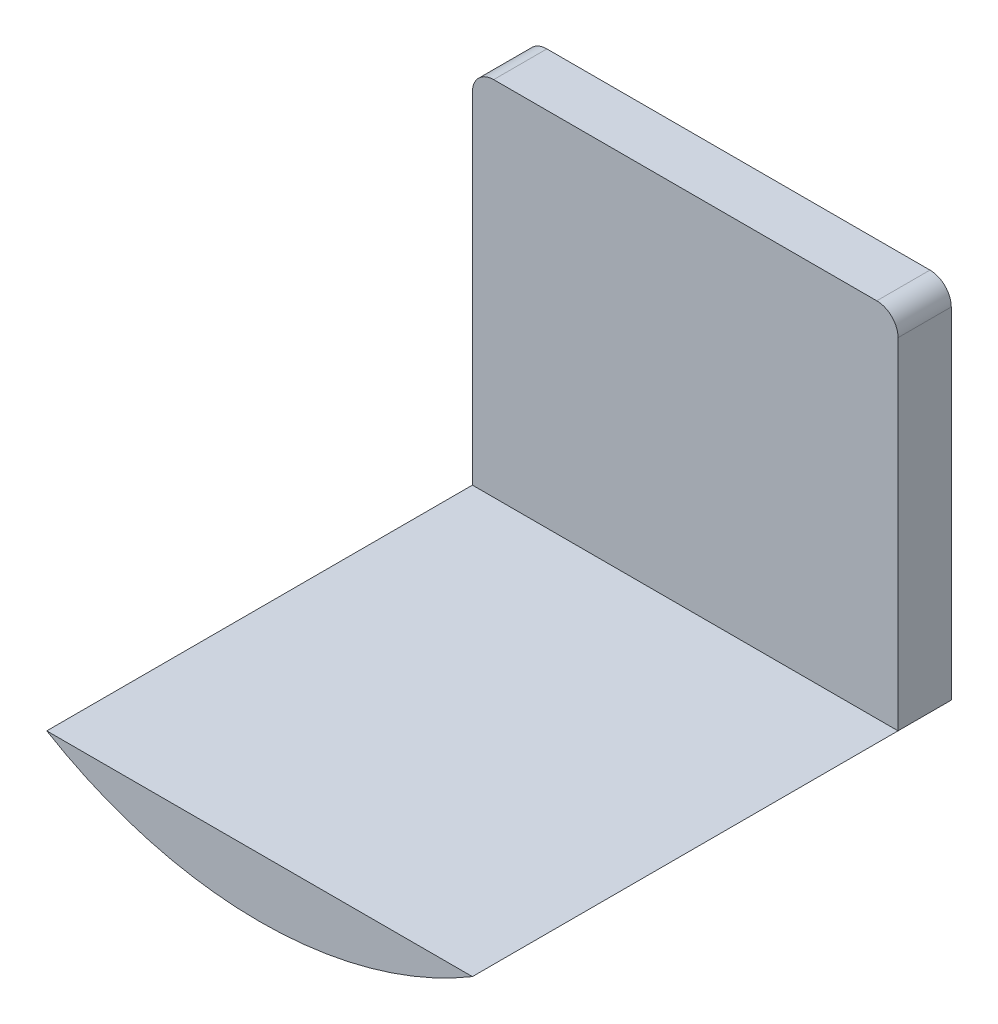
ISO-10303-21;
HEADER;
FILE_DESCRIPTION(('STEP AP214'),'2;1');
FILE_NAME('part.step','',(''),(''),'','','');
FILE_SCHEMA(('AUTOMOTIVE_DESIGN { 1 0 10303 214 1 1 1 1 }'));
ENDSEC;
DATA;
#1=APPLICATION_CONTEXT('core data for automotive mechanical design processes');
#2=APPLICATION_PROTOCOL_DEFINITION('international standard','automotive_design',2000,#1);
#3=PRODUCT_CONTEXT('',#1,'mechanical');
#4=PRODUCT('Part','Part','',(#3));
#5=PRODUCT_RELATED_PRODUCT_CATEGORY('part','',(#4));
#6=PRODUCT_DEFINITION_FORMATION('','',#4);
#7=PRODUCT_DEFINITION_CONTEXT('part definition',#1,'design');
#8=PRODUCT_DEFINITION('design','',#6,#7);
#9=PRODUCT_DEFINITION_SHAPE('','',#8);
#10=(LENGTH_UNIT() NAMED_UNIT(*) SI_UNIT(.MILLI.,.METRE.));
#11=(NAMED_UNIT(*) PLANE_ANGLE_UNIT() SI_UNIT($,.RADIAN.));
#12=(NAMED_UNIT(*) SI_UNIT($,.STERADIAN.) SOLID_ANGLE_UNIT());
#13=UNCERTAINTY_MEASURE_WITH_UNIT(LENGTH_MEASURE(1.E-05),#10,'distance_accuracy_value','');
#14=(GEOMETRIC_REPRESENTATION_CONTEXT(3) GLOBAL_UNCERTAINTY_ASSIGNED_CONTEXT((#13)) GLOBAL_UNIT_ASSIGNED_CONTEXT((#10,
#11,#12)) REPRESENTATION_CONTEXT('',''));
#15=CARTESIAN_POINT('',(0.,0.,0.));
#16=DIRECTION('',(0.,0.,1.));
#17=DIRECTION('',(1.,0.,0.));
#18=AXIS2_PLACEMENT_3D('',#15,#16,#17);
#19=CARTESIAN_POINT('',(-25.4,-42.5212993686693,57.15));
#20=DIRECTION('',(0.,-1.,0.));
#21=DIRECTION('',(0.,0.,-1.));
#22=AXIS2_PLACEMENT_3D('',#19,#20,#21);
#23=PLANE('',#22);
#24=DIRECTION('',(1.,0.,0.));
#25=VECTOR('',#24,1.);
#26=CARTESIAN_POINT('',(-25.4,-42.5212993686693,6.35));
#27=LINE('',#26,#25);
#28=CARTESIAN_POINT('',(-25.4,-42.5212993686693,6.35));
#29=VERTEX_POINT('',#28);
#30=CARTESIAN_POINT('',(25.4,-42.5212993686693,6.35));
#31=VERTEX_POINT('',#30);
#32=EDGE_CURVE('E120',#29,#31,#27,.T.);
#33=ORIENTED_EDGE('',*,*,#32,.F.);
#34=DIRECTION('',(0.,0.,-1.));
#35=VECTOR('',#34,1.);
#36=CARTESIAN_POINT('',(-25.4,-42.5212993686693,57.15));
#37=LINE('',#36,#35);
#38=CARTESIAN_POINT('',(-25.4,-42.5212993686693,57.15));
#39=VERTEX_POINT('',#38);
#40=EDGE_CURVE('E119',#39,#29,#37,.T.);
#41=ORIENTED_EDGE('',*,*,#40,.F.);
#42=DIRECTION('',(-1.,0.,0.));
#43=VECTOR('',#42,1.);
#44=CARTESIAN_POINT('',(-25.4,-42.5212993686693,57.15));
#45=LINE('',#44,#43);
#46=CARTESIAN_POINT('',(25.4,-42.5212993686693,57.15));
#47=VERTEX_POINT('',#46);
#48=EDGE_CURVE('E136',#47,#39,#45,.T.);
#49=ORIENTED_EDGE('',*,*,#48,.F.);
#50=DIRECTION('',(0.,0.,-1.));
#51=VECTOR('',#50,1.);
#52=CARTESIAN_POINT('',(25.4,-42.5212993686693,57.15));
#53=LINE('',#52,#51);
#54=EDGE_CURVE('E139',#47,#31,#53,.T.);
#55=ORIENTED_EDGE('',*,*,#54,.T.);
#56=EDGE_LOOP('',(#33,#41,#49,#55));
#57=FACE_BOUND('',#56,.T.);
#58=ADVANCED_FACE('F35',(#57),#23,.F.);
#59=CARTESIAN_POINT('',(0.,0.,57.15));
#60=DIRECTION('',(0.,0.,-1.));
#61=DIRECTION('',(-1.,0.,0.));
#62=AXIS2_PLACEMENT_3D('',#59,#60,#61);
#63=CYLINDRICAL_SURFACE('',#62,49.53);
#64=CARTESIAN_POINT('',(0.,0.,0.));
#65=DIRECTION('',(0.,0.,1.));
#66=DIRECTION('',(1.,0.,0.));
#67=AXIS2_PLACEMENT_3D('',#64,#65,#66);
#68=CIRCLE('',#67,49.53);
#69=CARTESIAN_POINT('',(-25.4,-42.5212993686693,0.));
#70=VERTEX_POINT('',#69);
#71=CARTESIAN_POINT('',(25.4,-42.5212993686693,0.));
#72=VERTEX_POINT('',#71);
#73=EDGE_CURVE('E106',#70,#72,#68,.T.);
#74=ORIENTED_EDGE('',*,*,#73,.T.);
#75=DIRECTION('',(0.,0.,-1.));
#76=VECTOR('',#75,1.);
#77=CARTESIAN_POINT('',(25.4,-42.5212993686693,0.));
#78=LINE('',#77,#76);
#79=EDGE_CURVE('E123',#31,#72,#78,.T.);
#80=ORIENTED_EDGE('',*,*,#79,.F.);
#81=ORIENTED_EDGE('',*,*,#54,.F.);
#82=CARTESIAN_POINT('',(0.,0.,57.15));
#83=DIRECTION('',(0.,0.,1.));
#84=DIRECTION('',(1.,0.,0.));
#85=AXIS2_PLACEMENT_3D('',#82,#83,#84);
#86=CIRCLE('',#85,49.53);
#87=EDGE_CURVE('E112',#39,#47,#86,.T.);
#88=ORIENTED_EDGE('',*,*,#87,.F.);
#89=ORIENTED_EDGE('',*,*,#40,.T.);
#90=DIRECTION('',(0.,0.,1.));
#91=VECTOR('',#90,1.);
#92=CARTESIAN_POINT('',(-25.4,-42.5212993686693,0.));
#93=LINE('',#92,#91);
#94=EDGE_CURVE('E98',#70,#29,#93,.T.);
#95=ORIENTED_EDGE('',*,*,#94,.F.);
#96=EDGE_LOOP('',(#74,#80,#81,#88,#89,#95));
#97=FACE_BOUND('',#96,.T.);
#98=ADVANCED_FACE('F116',(#97),#63,.T.);
#99=CARTESIAN_POINT('',(0.,0.,57.15));
#100=DIRECTION('',(0.,0.,1.));
#101=DIRECTION('',(1.,0.,0.));
#102=AXIS2_PLACEMENT_3D('',#99,#100,#101);
#103=PLANE('',#102);
#104=ORIENTED_EDGE('',*,*,#87,.T.);
#105=ORIENTED_EDGE('',*,*,#48,.T.);
#106=EDGE_LOOP('',(#104,#105));
#107=FACE_BOUND('',#106,.T.);
#108=ADVANCED_FACE('F177',(#107),#103,.T.);
#109=CARTESIAN_POINT('',(0.,0.,0.));
#110=DIRECTION('',(0.,0.,1.));
#111=DIRECTION('',(1.,0.,0.));
#112=AXIS2_PLACEMENT_3D('',#109,#110,#111);
#113=PLANE('',#112);
#114=DIRECTION('',(-1.,0.,0.));
#115=VECTOR('',#114,1.);
#116=CARTESIAN_POINT('',(-25.4,0.658700631330653,0.));
#117=LINE('',#116,#115);
#118=CARTESIAN_POINT('',(22.86,0.658700631330653,0.));
#119=VERTEX_POINT('',#118);
#120=CARTESIAN_POINT('',(-22.86,0.658700631330653,0.));
#121=VERTEX_POINT('',#120);
#122=EDGE_CURVE('E103',#119,#121,#117,.T.);
#123=ORIENTED_EDGE('',*,*,#122,.F.);
#124=CARTESIAN_POINT('',(22.86,-1.88129936866935,0.));
#125=DIRECTION('',(0.,0.,1.));
#126=DIRECTION('',(1.,0.,0.));
#127=AXIS2_PLACEMENT_3D('',#124,#125,#126);
#128=CIRCLE('',#127,2.54);
#129=CARTESIAN_POINT('',(25.4,-1.88129936866935,0.));
#130=VERTEX_POINT('',#129);
#131=EDGE_CURVE('E150',#119,#130,#128,.F.);
#132=ORIENTED_EDGE('',*,*,#131,.T.);
#133=DIRECTION('',(0.,-1.,0.));
#134=VECTOR('',#133,1.);
#135=CARTESIAN_POINT('',(25.4,0.658700631330653,0.));
#136=LINE('',#135,#134);
#137=EDGE_CURVE('E102',#130,#72,#136,.T.);
#138=ORIENTED_EDGE('',*,*,#137,.T.);
#139=ORIENTED_EDGE('',*,*,#73,.F.);
#140=DIRECTION('',(0.,-1.,0.));
#141=VECTOR('',#140,1.);
#142=CARTESIAN_POINT('',(-25.4,0.658700631330653,0.));
#143=LINE('',#142,#141);
#144=CARTESIAN_POINT('',(-25.4,-1.88129936866935,0.));
#145=VERTEX_POINT('',#144);
#146=EDGE_CURVE('E94',#145,#70,#143,.T.);
#147=ORIENTED_EDGE('',*,*,#146,.F.);
#148=CARTESIAN_POINT('',(-22.86,-1.88129936866935,0.));
#149=DIRECTION('',(0.,0.,1.));
#150=DIRECTION('',(1.,0.,0.));
#151=AXIS2_PLACEMENT_3D('',#148,#149,#150);
#152=CIRCLE('',#151,2.54);
#153=EDGE_CURVE('E148',#145,#121,#152,.F.);
#154=ORIENTED_EDGE('',*,*,#153,.T.);
#155=EDGE_LOOP('',(#123,#132,#138,#139,#147,#154));
#156=FACE_BOUND('',#155,.T.);
#157=ADVANCED_FACE('F108',(#156),#113,.F.);
#158=CARTESIAN_POINT('',(-25.4,0.658700631330653,0.));
#159=DIRECTION('',(1.,0.,0.));
#160=DIRECTION('',(0.,0.,-1.));
#161=AXIS2_PLACEMENT_3D('',#158,#159,#160);
#162=PLANE('',#161);
#163=DIRECTION('',(0.,-1.,0.));
#164=VECTOR('',#163,1.);
#165=CARTESIAN_POINT('',(-25.4,0.658700631330653,6.35));
#166=LINE('',#165,#164);
#167=CARTESIAN_POINT('',(-25.4,-1.88129936866935,6.35));
#168=VERTEX_POINT('',#167);
#169=EDGE_CURVE('E113',#168,#29,#166,.T.);
#170=ORIENTED_EDGE('',*,*,#169,.F.);
#171=DIRECTION('',(0.,0.,1.));
#172=VECTOR('',#171,1.);
#173=CARTESIAN_POINT('',(-25.4,-1.88129936866935,0.));
#174=LINE('',#173,#172);
#175=EDGE_CURVE('E11',#168,#145,#174,.F.);
#176=ORIENTED_EDGE('',*,*,#175,.T.);
#177=ORIENTED_EDGE('',*,*,#146,.T.);
#178=ORIENTED_EDGE('',*,*,#94,.T.);
#179=EDGE_LOOP('',(#170,#176,#177,#178));
#180=FACE_BOUND('',#179,.T.);
#181=ADVANCED_FACE('F96',(#180),#162,.F.);
#182=CARTESIAN_POINT('',(-25.4,0.658700631330653,6.35));
#183=DIRECTION('',(0.,0.,-1.));
#184=DIRECTION('',(-1.,0.,0.));
#185=AXIS2_PLACEMENT_3D('',#182,#183,#184);
#186=PLANE('',#185);
#187=DIRECTION('',(0.,-1.,0.));
#188=VECTOR('',#187,1.);
#189=CARTESIAN_POINT('',(25.4,0.658700631330653,6.35));
#190=LINE('',#189,#188);
#191=CARTESIAN_POINT('',(25.4,-1.88129936866935,6.35));
#192=VERTEX_POINT('',#191);
#193=EDGE_CURVE('E131',#192,#31,#190,.T.);
#194=ORIENTED_EDGE('',*,*,#193,.F.);
#195=CARTESIAN_POINT('',(22.86,-1.88129936866935,6.35));
#196=DIRECTION('',(0.,0.,-1.));
#197=DIRECTION('',(-1.,0.,0.));
#198=AXIS2_PLACEMENT_3D('',#195,#196,#197);
#199=CIRCLE('',#198,2.54);
#200=CARTESIAN_POINT('',(22.86,0.658700631330653,6.35));
#201=VERTEX_POINT('',#200);
#202=EDGE_CURVE('E43',#192,#201,#199,.F.);
#203=ORIENTED_EDGE('',*,*,#202,.T.);
#204=DIRECTION('',(1.,0.,0.));
#205=VECTOR('',#204,1.);
#206=CARTESIAN_POINT('',(-25.4,0.658700631330653,6.35));
#207=LINE('',#206,#205);
#208=CARTESIAN_POINT('',(-22.86,0.658700631330653,6.35));
#209=VERTEX_POINT('',#208);
#210=EDGE_CURVE('E128',#209,#201,#207,.T.);
#211=ORIENTED_EDGE('',*,*,#210,.F.);
#212=CARTESIAN_POINT('',(-22.86,-1.88129936866935,6.35));
#213=DIRECTION('',(0.,0.,-1.));
#214=DIRECTION('',(-1.,0.,0.));
#215=AXIS2_PLACEMENT_3D('',#212,#213,#214);
#216=CIRCLE('',#215,2.54);
#217=EDGE_CURVE('E50',#209,#168,#216,.F.);
#218=ORIENTED_EDGE('',*,*,#217,.T.);
#219=ORIENTED_EDGE('',*,*,#169,.T.);
#220=ORIENTED_EDGE('',*,*,#32,.T.);
#221=EDGE_LOOP('',(#194,#203,#211,#218,#219,#220));
#222=FACE_BOUND('',#221,.T.);
#223=ADVANCED_FACE('F155',(#222),#186,.F.);
#224=CARTESIAN_POINT('',(25.4,0.658700631330653,0.));
#225=DIRECTION('',(-1.,0.,0.));
#226=DIRECTION('',(0.,0.,1.));
#227=AXIS2_PLACEMENT_3D('',#224,#225,#226);
#228=PLANE('',#227);
#229=ORIENTED_EDGE('',*,*,#137,.F.);
#230=DIRECTION('',(0.,0.,-1.));
#231=VECTOR('',#230,1.);
#232=CARTESIAN_POINT('',(25.4,-1.88129936866935,6.35));
#233=LINE('',#232,#231);
#234=EDGE_CURVE('E58',#130,#192,#233,.F.);
#235=ORIENTED_EDGE('',*,*,#234,.T.);
#236=ORIENTED_EDGE('',*,*,#193,.T.);
#237=ORIENTED_EDGE('',*,*,#79,.T.);
#238=EDGE_LOOP('',(#229,#235,#236,#237));
#239=FACE_BOUND('',#238,.T.);
#240=ADVANCED_FACE('F163',(#239),#228,.F.);
#241=CARTESIAN_POINT('',(0.,0.658700631330653,0.));
#242=DIRECTION('',(0.,1.,0.));
#243=DIRECTION('',(0.,0.,1.));
#244=AXIS2_PLACEMENT_3D('',#241,#242,#243);
#245=PLANE('',#244);
#246=ORIENTED_EDGE('',*,*,#210,.T.);
#247=DIRECTION('',(0.,0.,-1.));
#248=VECTOR('',#247,1.);
#249=CARTESIAN_POINT('',(22.86,0.658700631330653,0.));
#250=LINE('',#249,#248);
#251=EDGE_CURVE('E145',#201,#119,#250,.T.);
#252=ORIENTED_EDGE('',*,*,#251,.T.);
#253=ORIENTED_EDGE('',*,*,#122,.T.);
#254=DIRECTION('',(0.,0.,1.));
#255=VECTOR('',#254,1.);
#256=CARTESIAN_POINT('',(-22.86,0.658700631330653,6.35));
#257=LINE('',#256,#255);
#258=EDGE_CURVE('E142',#121,#209,#257,.T.);
#259=ORIENTED_EDGE('',*,*,#258,.T.);
#260=EDGE_LOOP('',(#246,#252,#253,#259));
#261=FACE_BOUND('',#260,.T.);
#262=ADVANCED_FACE('F159',(#261),#245,.T.);
#263=CARTESIAN_POINT('',(22.86,-1.88129936866935,0.));
#264=DIRECTION('',(0.,0.,1.));
#265=DIRECTION('',(1.,0.,0.));
#266=AXIS2_PLACEMENT_3D('',#263,#264,#265);
#267=CYLINDRICAL_SURFACE('',#266,2.54);
#268=ORIENTED_EDGE('',*,*,#202,.F.);
#269=ORIENTED_EDGE('',*,*,#234,.F.);
#270=ORIENTED_EDGE('',*,*,#131,.F.);
#271=ORIENTED_EDGE('',*,*,#251,.F.);
#272=EDGE_LOOP('',(#268,#269,#270,#271));
#273=FACE_BOUND('',#272,.T.);
#274=ADVANCED_FACE('F162',(#273),#267,.T.);
#275=CARTESIAN_POINT('',(-22.86,-1.88129936866935,0.));
#276=DIRECTION('',(0.,0.,-1.));
#277=DIRECTION('',(-1.,0.,0.));
#278=AXIS2_PLACEMENT_3D('',#275,#276,#277);
#279=CYLINDRICAL_SURFACE('',#278,2.54);
#280=ORIENTED_EDGE('',*,*,#153,.F.);
#281=ORIENTED_EDGE('',*,*,#175,.F.);
#282=ORIENTED_EDGE('',*,*,#217,.F.);
#283=ORIENTED_EDGE('',*,*,#258,.F.);
#284=EDGE_LOOP('',(#280,#281,#282,#283));
#285=FACE_BOUND('',#284,.T.);
#286=ADVANCED_FACE('F37',(#285),#279,.T.);
#287=CLOSED_SHELL('',(#58,#98,#108,#157,#181,#223,#240,#262,#274,#286));
#288=MANIFOLD_SOLID_BREP('B2',#287);
#289=ADVANCED_BREP_SHAPE_REPRESENTATION('',(#18,#288),#14);
#290=SHAPE_DEFINITION_REPRESENTATION(#9,#289);
ENDSEC;
END-ISO-10303-21;
